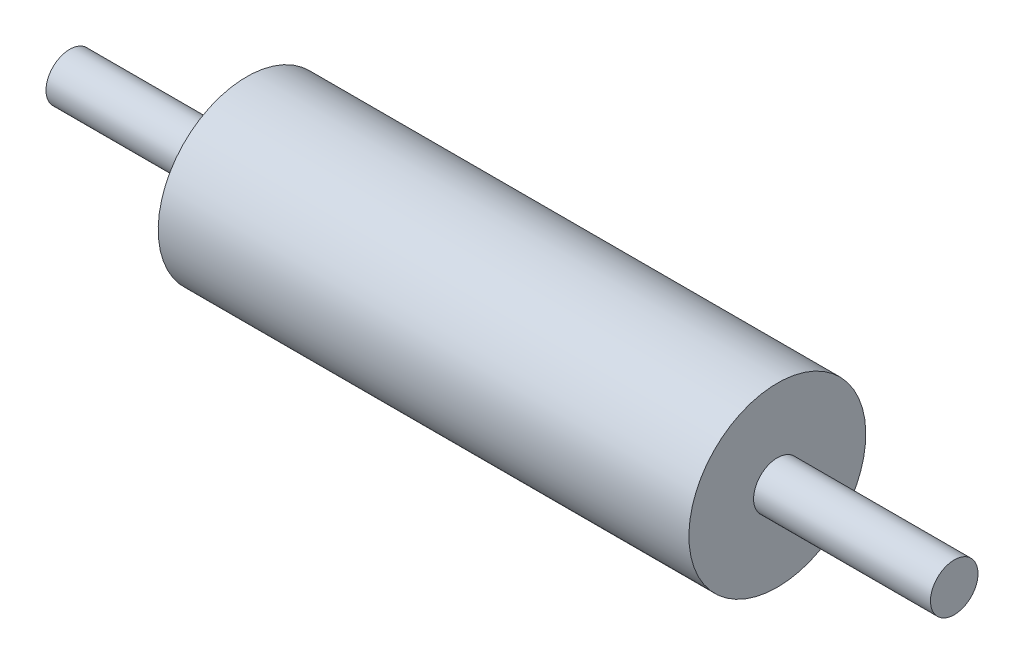
ISO-10303-21;
HEADER;
FILE_DESCRIPTION(('STEP AP214'),'2;1');
FILE_NAME('part.step','',(''),(''),'','','');
FILE_SCHEMA(('AUTOMOTIVE_DESIGN { 1 0 10303 214 1 1 1 1 }'));
ENDSEC;
DATA;
#1=APPLICATION_CONTEXT('core data for automotive mechanical design processes');
#2=APPLICATION_PROTOCOL_DEFINITION('international standard','automotive_design',2000,#1);
#3=PRODUCT_CONTEXT('',#1,'mechanical');
#4=PRODUCT('Part','Part','',(#3));
#5=PRODUCT_RELATED_PRODUCT_CATEGORY('part','',(#4));
#6=PRODUCT_DEFINITION_FORMATION('','',#4);
#7=PRODUCT_DEFINITION_CONTEXT('part definition',#1,'design');
#8=PRODUCT_DEFINITION('design','',#6,#7);
#9=PRODUCT_DEFINITION_SHAPE('','',#8);
#10=(LENGTH_UNIT() NAMED_UNIT(*) SI_UNIT(.MILLI.,.METRE.));
#11=(NAMED_UNIT(*) PLANE_ANGLE_UNIT() SI_UNIT($,.RADIAN.));
#12=(NAMED_UNIT(*) SI_UNIT($,.STERADIAN.) SOLID_ANGLE_UNIT());
#13=UNCERTAINTY_MEASURE_WITH_UNIT(LENGTH_MEASURE(1.E-05),#10,'distance_accuracy_value','');
#14=(GEOMETRIC_REPRESENTATION_CONTEXT(3) GLOBAL_UNCERTAINTY_ASSIGNED_CONTEXT((#13)) GLOBAL_UNIT_ASSIGNED_CONTEXT((#10,
#11,#12)) REPRESENTATION_CONTEXT('',''));
#15=CARTESIAN_POINT('',(0.,0.,0.));
#16=DIRECTION('',(0.,0.,1.));
#17=DIRECTION('',(1.,0.,0.));
#18=AXIS2_PLACEMENT_3D('',#15,#16,#17);
#19=CARTESIAN_POINT('',(0.,0.,0.));
#20=DIRECTION('',(-1.,0.,0.));
#21=DIRECTION('',(0.,-1.,0.));
#22=AXIS2_PLACEMENT_3D('',#19,#20,#21);
#23=CYLINDRICAL_SURFACE('',#22,0.268728710694694);
#24=CARTESIAN_POINT('',(8.,0.,0.));
#25=DIRECTION('',(-1.,0.,0.));
#26=DIRECTION('',(0.,-1.,0.));
#27=AXIS2_PLACEMENT_3D('',#24,#25,#26);
#28=CIRCLE('',#27,0.268728710694694);
#29=CARTESIAN_POINT('',(8.,-0.268728710694694,0.));
#30=VERTEX_POINT('',#29);
#31=EDGE_CURVE('E52',#30,#30,#28,.T.);
#32=ORIENTED_EDGE('',*,*,#31,.F.);
#33=EDGE_LOOP('',(#32));
#34=FACE_BOUND('',#33,.T.);
#35=CARTESIAN_POINT('',(10.,0.,0.));
#36=DIRECTION('',(-1.,0.,0.));
#37=DIRECTION('',(0.,-1.,0.));
#38=AXIS2_PLACEMENT_3D('',#35,#36,#37);
#39=CIRCLE('',#38,0.268728710694694);
#40=CARTESIAN_POINT('',(10.,-0.268728710694694,0.));
#41=VERTEX_POINT('',#40);
#42=EDGE_CURVE('E10',#41,#41,#39,.T.);
#43=ORIENTED_EDGE('',*,*,#42,.T.);
#44=EDGE_LOOP('',(#43));
#45=FACE_BOUND('',#44,.T.);
#46=ADVANCED_FACE('F30',(#34,#45),#23,.T.);
#47=CARTESIAN_POINT('',(10.,0.268728710694694,0.));
#48=DIRECTION('',(-1.,0.,0.));
#49=DIRECTION('',(0.,-1.,0.));
#50=AXIS2_PLACEMENT_3D('',#47,#48,#49);
#51=PLANE('',#50);
#52=ORIENTED_EDGE('',*,*,#42,.F.);
#53=EDGE_LOOP('',(#52));
#54=FACE_BOUND('',#53,.T.);
#55=ADVANCED_FACE('F59',(#54),#51,.F.);
#56=CARTESIAN_POINT('',(0.,0.,0.));
#57=DIRECTION('',(1.,0.,0.));
#58=DIRECTION('',(0.,1.,0.));
#59=AXIS2_PLACEMENT_3D('',#56,#57,#58);
#60=PLANE('',#59);
#61=CARTESIAN_POINT('',(0.,0.,0.));
#62=DIRECTION('',(-1.,0.,0.));
#63=DIRECTION('',(0.,-1.,0.));
#64=AXIS2_PLACEMENT_3D('',#61,#62,#63);
#65=CIRCLE('',#64,0.268728710694694);
#66=CARTESIAN_POINT('',(0.,-0.268728710694694,0.));
#67=VERTEX_POINT('',#66);
#68=EDGE_CURVE('E36',#67,#67,#65,.T.);
#69=ORIENTED_EDGE('',*,*,#68,.T.);
#70=EDGE_LOOP('',(#69));
#71=FACE_BOUND('',#70,.T.);
#72=ADVANCED_FACE('F63',(#71),#60,.F.);
#73=CARTESIAN_POINT('',(0.,0.,0.));
#74=DIRECTION('',(-1.,0.,0.));
#75=DIRECTION('',(0.,-1.,0.));
#76=AXIS2_PLACEMENT_3D('',#73,#74,#75);
#77=CYLINDRICAL_SURFACE('',#76,0.268728710694694);
#78=ORIENTED_EDGE('',*,*,#68,.F.);
#79=EDGE_LOOP('',(#78));
#80=FACE_BOUND('',#79,.T.);
#81=CARTESIAN_POINT('',(2.,0.,0.));
#82=DIRECTION('',(-1.,0.,0.));
#83=DIRECTION('',(0.,-1.,0.));
#84=AXIS2_PLACEMENT_3D('',#81,#82,#83);
#85=CIRCLE('',#84,0.268728710694694);
#86=CARTESIAN_POINT('',(2.,-0.268728710694694,0.));
#87=VERTEX_POINT('',#86);
#88=EDGE_CURVE('E40',#87,#87,#85,.T.);
#89=ORIENTED_EDGE('',*,*,#88,.T.);
#90=EDGE_LOOP('',(#89));
#91=FACE_BOUND('',#90,.T.);
#92=ADVANCED_FACE('F68',(#80,#91),#77,.T.);
#93=CARTESIAN_POINT('',(2.,0.999999999999999,0.));
#94=DIRECTION('',(1.,0.,0.));
#95=DIRECTION('',(0.,1.,0.));
#96=AXIS2_PLACEMENT_3D('',#93,#94,#95);
#97=PLANE('',#96);
#98=ORIENTED_EDGE('',*,*,#88,.F.);
#99=EDGE_LOOP('',(#98));
#100=FACE_BOUND('',#99,.T.);
#101=CARTESIAN_POINT('',(2.,0.,0.));
#102=DIRECTION('',(-1.,0.,0.));
#103=DIRECTION('',(0.,-1.,0.));
#104=AXIS2_PLACEMENT_3D('',#101,#102,#103);
#105=CIRCLE('',#104,0.999999999999999);
#106=CARTESIAN_POINT('',(2.,-0.999999999999999,0.));
#107=VERTEX_POINT('',#106);
#108=EDGE_CURVE('E44',#107,#107,#105,.T.);
#109=ORIENTED_EDGE('',*,*,#108,.T.);
#110=EDGE_LOOP('',(#109));
#111=FACE_BOUND('',#110,.T.);
#112=ADVANCED_FACE('F73',(#100,#111),#97,.F.);
#113=CARTESIAN_POINT('',(0.,0.,0.));
#114=DIRECTION('',(-1.,0.,0.));
#115=DIRECTION('',(0.,-1.,0.));
#116=AXIS2_PLACEMENT_3D('',#113,#114,#115);
#117=CYLINDRICAL_SURFACE('',#116,1.);
#118=ORIENTED_EDGE('',*,*,#108,.F.);
#119=EDGE_LOOP('',(#118));
#120=FACE_BOUND('',#119,.T.);
#121=CARTESIAN_POINT('',(8.,0.,0.));
#122=DIRECTION('',(-1.,0.,0.));
#123=DIRECTION('',(0.,-1.,0.));
#124=AXIS2_PLACEMENT_3D('',#121,#122,#123);
#125=CIRCLE('',#124,1.);
#126=CARTESIAN_POINT('',(8.,-1.,0.));
#127=VERTEX_POINT('',#126);
#128=EDGE_CURVE('E49',#127,#127,#125,.T.);
#129=ORIENTED_EDGE('',*,*,#128,.T.);
#130=EDGE_LOOP('',(#129));
#131=FACE_BOUND('',#130,.T.);
#132=ADVANCED_FACE('F77',(#120,#131),#117,.T.);
#133=CARTESIAN_POINT('',(8.,0.268728710694694,0.));
#134=DIRECTION('',(-1.,0.,0.));
#135=DIRECTION('',(0.,-1.,0.));
#136=AXIS2_PLACEMENT_3D('',#133,#134,#135);
#137=PLANE('',#136);
#138=ORIENTED_EDGE('',*,*,#128,.F.);
#139=EDGE_LOOP('',(#138));
#140=FACE_BOUND('',#139,.T.);
#141=ORIENTED_EDGE('',*,*,#31,.T.);
#142=EDGE_LOOP('',(#141));
#143=FACE_BOUND('',#142,.T.);
#144=ADVANCED_FACE('F56',(#140,#143),#137,.F.);
#145=CLOSED_SHELL('',(#46,#55,#72,#92,#112,#132,#144));
#146=MANIFOLD_SOLID_BREP('B2',#145);
#147=ADVANCED_BREP_SHAPE_REPRESENTATION('',(#18,#146),#14);
#148=SHAPE_DEFINITION_REPRESENTATION(#9,#147);
ENDSEC;
END-ISO-10303-21;
